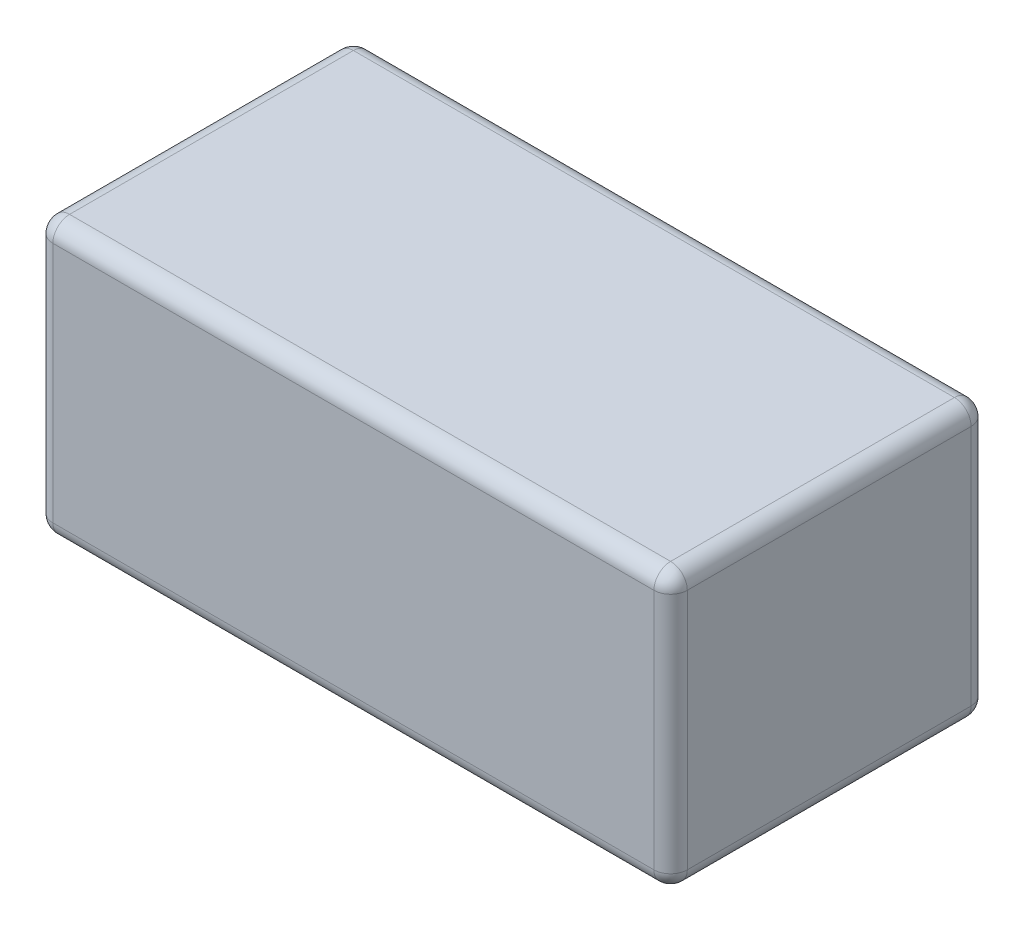
ISO-10303-21;
HEADER;
FILE_DESCRIPTION(('STEP AP214'),'2;1');
FILE_NAME('part.step','',(''),(''),'','','');
FILE_SCHEMA(('AUTOMOTIVE_DESIGN { 1 0 10303 214 1 1 1 1 }'));
ENDSEC;
DATA;
#1=APPLICATION_CONTEXT('core data for automotive mechanical design processes');
#2=APPLICATION_PROTOCOL_DEFINITION('international standard','automotive_design',2000,#1);
#3=PRODUCT_CONTEXT('',#1,'mechanical');
#4=PRODUCT('Part','Part','',(#3));
#5=PRODUCT_RELATED_PRODUCT_CATEGORY('part','',(#4));
#6=PRODUCT_DEFINITION_FORMATION('','',#4);
#7=PRODUCT_DEFINITION_CONTEXT('part definition',#1,'design');
#8=PRODUCT_DEFINITION('design','',#6,#7);
#9=PRODUCT_DEFINITION_SHAPE('','',#8);
#10=(LENGTH_UNIT() NAMED_UNIT(*) SI_UNIT(.MILLI.,.METRE.));
#11=(NAMED_UNIT(*) PLANE_ANGLE_UNIT() SI_UNIT($,.RADIAN.));
#12=(NAMED_UNIT(*) SI_UNIT($,.STERADIAN.) SOLID_ANGLE_UNIT());
#13=UNCERTAINTY_MEASURE_WITH_UNIT(LENGTH_MEASURE(1.E-05),#10,'distance_accuracy_value','');
#14=(GEOMETRIC_REPRESENTATION_CONTEXT(3) GLOBAL_UNCERTAINTY_ASSIGNED_CONTEXT((#13)) GLOBAL_UNIT_ASSIGNED_CONTEXT((#10,
#11,#12)) REPRESENTATION_CONTEXT('',''));
#15=CARTESIAN_POINT('',(0.,0.,0.));
#16=DIRECTION('',(0.,0.,1.));
#17=DIRECTION('',(1.,0.,0.));
#18=AXIS2_PLACEMENT_3D('',#15,#16,#17);
#19=CARTESIAN_POINT('',(38.,33.,19.));
#20=DIRECTION('',(-1.,0.,0.));
#21=DIRECTION('',(0.,0.,1.));
#22=AXIS2_PLACEMENT_3D('',#19,#20,#21);
#23=PLANE('',#22);
#24=DIRECTION('',(0.,0.,-1.));
#25=VECTOR('',#24,1.);
#26=CARTESIAN_POINT('',(38.,31.,19.));
#27=LINE('',#26,#25);
#28=CARTESIAN_POINT('',(38.,31.,-17.));
#29=VERTEX_POINT('',#28);
#30=CARTESIAN_POINT('',(38.,31.,17.));
#31=VERTEX_POINT('',#30);
#32=EDGE_CURVE('E53',#29,#31,#27,.F.);
#33=ORIENTED_EDGE('',*,*,#32,.T.);
#34=DIRECTION('',(0.,-1.,0.));
#35=VECTOR('',#34,1.);
#36=CARTESIAN_POINT('',(38.,33.,17.));
#37=LINE('',#36,#35);
#38=CARTESIAN_POINT('',(38.,2.,17.));
#39=VERTEX_POINT('',#38);
#40=EDGE_CURVE('E11',#31,#39,#37,.T.);
#41=ORIENTED_EDGE('',*,*,#40,.T.);
#42=DIRECTION('',(0.,0.,-1.));
#43=VECTOR('',#42,1.);
#44=CARTESIAN_POINT('',(38.,2.,-19.));
#45=LINE('',#44,#43);
#46=CARTESIAN_POINT('',(38.,2.,-17.));
#47=VERTEX_POINT('',#46);
#48=EDGE_CURVE('E226',#39,#47,#45,.T.);
#49=ORIENTED_EDGE('',*,*,#48,.T.);
#50=DIRECTION('',(0.,-1.,0.));
#51=VECTOR('',#50,1.);
#52=CARTESIAN_POINT('',(38.,33.,-17.));
#53=LINE('',#52,#51);
#54=EDGE_CURVE('E64',#47,#29,#53,.F.);
#55=ORIENTED_EDGE('',*,*,#54,.T.);
#56=EDGE_LOOP('',(#33,#41,#49,#55));
#57=FACE_BOUND('',#56,.T.);
#58=ADVANCED_FACE('F43',(#57),#23,.F.);
#59=CARTESIAN_POINT('',(-38.,33.,-19.));
#60=DIRECTION('',(0.,0.,1.));
#61=DIRECTION('',(1.,0.,0.));
#62=AXIS2_PLACEMENT_3D('',#59,#60,#61);
#63=PLANE('',#62);
#64=DIRECTION('',(0.,-1.,0.));
#65=VECTOR('',#64,1.);
#66=CARTESIAN_POINT('',(-36.,33.,-19.));
#67=LINE('',#66,#65);
#68=CARTESIAN_POINT('',(-36.,2.,-19.));
#69=VERTEX_POINT('',#68);
#70=CARTESIAN_POINT('',(-36.,31.,-19.));
#71=VERTEX_POINT('',#70);
#72=EDGE_CURVE('E219',#69,#71,#67,.F.);
#73=ORIENTED_EDGE('',*,*,#72,.T.);
#74=DIRECTION('',(-1.,0.,0.));
#75=VECTOR('',#74,1.);
#76=CARTESIAN_POINT('',(-38.,31.,-19.));
#77=LINE('',#76,#75);
#78=CARTESIAN_POINT('',(36.,31.,-19.));
#79=VERTEX_POINT('',#78);
#80=EDGE_CURVE('E222',#71,#79,#77,.F.);
#81=ORIENTED_EDGE('',*,*,#80,.T.);
#82=DIRECTION('',(0.,-1.,0.));
#83=VECTOR('',#82,1.);
#84=CARTESIAN_POINT('',(36.,33.,-19.));
#85=LINE('',#84,#83);
#86=CARTESIAN_POINT('',(36.,2.,-19.));
#87=VERTEX_POINT('',#86);
#88=EDGE_CURVE('E213',#79,#87,#85,.T.);
#89=ORIENTED_EDGE('',*,*,#88,.T.);
#90=DIRECTION('',(-1.,0.,0.));
#91=VECTOR('',#90,1.);
#92=CARTESIAN_POINT('',(-38.,2.,-19.));
#93=LINE('',#92,#91);
#94=EDGE_CURVE('E216',#87,#69,#93,.T.);
#95=ORIENTED_EDGE('',*,*,#94,.T.);
#96=EDGE_LOOP('',(#73,#81,#89,#95));
#97=FACE_BOUND('',#96,.T.);
#98=ADVANCED_FACE('F357',(#97),#63,.F.);
#99=CARTESIAN_POINT('',(-38.,33.,19.));
#100=DIRECTION('',(1.,0.,0.));
#101=DIRECTION('',(0.,0.,-1.));
#102=AXIS2_PLACEMENT_3D('',#99,#100,#101);
#103=PLANE('',#102);
#104=DIRECTION('',(0.,-1.,0.));
#105=VECTOR('',#104,1.);
#106=CARTESIAN_POINT('',(-38.,33.,17.));
#107=LINE('',#106,#105);
#108=CARTESIAN_POINT('',(-38.,2.,17.));
#109=VERTEX_POINT('',#108);
#110=CARTESIAN_POINT('',(-38.,31.,17.));
#111=VERTEX_POINT('',#110);
#112=EDGE_CURVE('E193',#109,#111,#107,.F.);
#113=ORIENTED_EDGE('',*,*,#112,.T.);
#114=DIRECTION('',(0.,0.,1.));
#115=VECTOR('',#114,1.);
#116=CARTESIAN_POINT('',(-38.,31.,19.));
#117=LINE('',#116,#115);
#118=CARTESIAN_POINT('',(-38.,31.,-17.));
#119=VERTEX_POINT('',#118);
#120=EDGE_CURVE('E196',#111,#119,#117,.F.);
#121=ORIENTED_EDGE('',*,*,#120,.T.);
#122=DIRECTION('',(0.,-1.,0.));
#123=VECTOR('',#122,1.);
#124=CARTESIAN_POINT('',(-38.,33.,-17.));
#125=LINE('',#124,#123);
#126=CARTESIAN_POINT('',(-38.,2.,-17.));
#127=VERTEX_POINT('',#126);
#128=EDGE_CURVE('E187',#119,#127,#125,.T.);
#129=ORIENTED_EDGE('',*,*,#128,.T.);
#130=DIRECTION('',(0.,0.,1.));
#131=VECTOR('',#130,1.);
#132=CARTESIAN_POINT('',(-38.,2.,19.));
#133=LINE('',#132,#131);
#134=EDGE_CURVE('E190',#127,#109,#133,.T.);
#135=ORIENTED_EDGE('',*,*,#134,.T.);
#136=EDGE_LOOP('',(#113,#121,#129,#135));
#137=FACE_BOUND('',#136,.T.);
#138=ADVANCED_FACE('F343',(#137),#103,.F.);
#139=CARTESIAN_POINT('',(-38.,33.,19.));
#140=DIRECTION('',(0.,0.,-1.));
#141=DIRECTION('',(-1.,0.,0.));
#142=AXIS2_PLACEMENT_3D('',#139,#140,#141);
#143=PLANE('',#142);
#144=DIRECTION('',(0.,-1.,0.));
#145=VECTOR('',#144,1.);
#146=CARTESIAN_POINT('',(36.,33.,19.));
#147=LINE('',#146,#145);
#148=CARTESIAN_POINT('',(36.,2.,19.));
#149=VERTEX_POINT('',#148);
#150=CARTESIAN_POINT('',(36.,31.,19.));
#151=VERTEX_POINT('',#150);
#152=EDGE_CURVE('E171',#149,#151,#147,.F.);
#153=ORIENTED_EDGE('',*,*,#152,.T.);
#154=DIRECTION('',(1.,0.,0.));
#155=VECTOR('',#154,1.);
#156=CARTESIAN_POINT('',(-38.,31.,19.));
#157=LINE('',#156,#155);
#158=CARTESIAN_POINT('',(-36.,31.,19.));
#159=VERTEX_POINT('',#158);
#160=EDGE_CURVE('E140',#151,#159,#157,.F.);
#161=ORIENTED_EDGE('',*,*,#160,.T.);
#162=DIRECTION('',(0.,-1.,0.));
#163=VECTOR('',#162,1.);
#164=CARTESIAN_POINT('',(-36.,33.,19.));
#165=LINE('',#164,#163);
#166=CARTESIAN_POINT('',(-36.,2.,19.));
#167=VERTEX_POINT('',#166);
#168=EDGE_CURVE('E182',#159,#167,#165,.T.);
#169=ORIENTED_EDGE('',*,*,#168,.T.);
#170=DIRECTION('',(1.,0.,0.));
#171=VECTOR('',#170,1.);
#172=CARTESIAN_POINT('',(38.,2.,19.));
#173=LINE('',#172,#171);
#174=EDGE_CURVE('E175',#167,#149,#173,.T.);
#175=ORIENTED_EDGE('',*,*,#174,.T.);
#176=EDGE_LOOP('',(#153,#161,#169,#175));
#177=FACE_BOUND('',#176,.T.);
#178=ADVANCED_FACE('F377',(#177),#143,.F.);
#179=CARTESIAN_POINT('',(0.,33.,0.));
#180=DIRECTION('',(0.,-1.,0.));
#181=DIRECTION('',(0.,0.,-1.));
#182=AXIS2_PLACEMENT_3D('',#179,#180,#181);
#183=PLANE('',#182);
#184=DIRECTION('',(0.,0.,1.));
#185=VECTOR('',#184,1.);
#186=CARTESIAN_POINT('',(-36.,33.,0.));
#187=LINE('',#186,#185);
#188=CARTESIAN_POINT('',(-36.,33.,-17.));
#189=VERTEX_POINT('',#188);
#190=CARTESIAN_POINT('',(-36.,33.,17.));
#191=VERTEX_POINT('',#190);
#192=EDGE_CURVE('E168',#189,#191,#187,.T.);
#193=ORIENTED_EDGE('',*,*,#192,.T.);
#194=DIRECTION('',(1.,0.,0.));
#195=VECTOR('',#194,1.);
#196=CARTESIAN_POINT('',(0.,33.,17.));
#197=LINE('',#196,#195);
#198=CARTESIAN_POINT('',(36.,33.,17.));
#199=VERTEX_POINT('',#198);
#200=EDGE_CURVE('E138',#191,#199,#197,.T.);
#201=ORIENTED_EDGE('',*,*,#200,.T.);
#202=DIRECTION('',(0.,0.,-1.));
#203=VECTOR('',#202,1.);
#204=CARTESIAN_POINT('',(36.,33.,0.));
#205=LINE('',#204,#203);
#206=CARTESIAN_POINT('',(36.,33.,-17.));
#207=VERTEX_POINT('',#206);
#208=EDGE_CURVE('E157',#199,#207,#205,.T.);
#209=ORIENTED_EDGE('',*,*,#208,.T.);
#210=DIRECTION('',(-1.,0.,0.));
#211=VECTOR('',#210,1.);
#212=CARTESIAN_POINT('',(0.,33.,-17.));
#213=LINE('',#212,#211);
#214=EDGE_CURVE('E164',#207,#189,#213,.T.);
#215=ORIENTED_EDGE('',*,*,#214,.T.);
#216=EDGE_LOOP('',(#193,#201,#209,#215));
#217=FACE_BOUND('',#216,.T.);
#218=ADVANCED_FACE('F166',(#217),#183,.F.);
#219=CARTESIAN_POINT('',(0.,0.,0.));
#220=DIRECTION('',(0.,-1.,0.));
#221=DIRECTION('',(0.,0.,-1.));
#222=AXIS2_PLACEMENT_3D('',#219,#220,#221);
#223=PLANE('',#222);
#224=DIRECTION('',(1.,0.,0.));
#225=VECTOR('',#224,1.);
#226=CARTESIAN_POINT('',(-38.,0.,17.));
#227=LINE('',#226,#225);
#228=CARTESIAN_POINT('',(36.,0.,17.));
#229=VERTEX_POINT('',#228);
#230=CARTESIAN_POINT('',(-36.,0.,17.));
#231=VERTEX_POINT('',#230);
#232=EDGE_CURVE('E206',#229,#231,#227,.F.);
#233=ORIENTED_EDGE('',*,*,#232,.T.);
#234=DIRECTION('',(0.,0.,1.));
#235=VECTOR('',#234,1.);
#236=CARTESIAN_POINT('',(-36.,0.,-19.));
#237=LINE('',#236,#235);
#238=CARTESIAN_POINT('',(-36.,0.,-17.));
#239=VERTEX_POINT('',#238);
#240=EDGE_CURVE('E209',#231,#239,#237,.F.);
#241=ORIENTED_EDGE('',*,*,#240,.T.);
#242=DIRECTION('',(-1.,0.,0.));
#243=VECTOR('',#242,1.);
#244=CARTESIAN_POINT('',(38.,0.,-17.));
#245=LINE('',#244,#243);
#246=CARTESIAN_POINT('',(36.,0.,-17.));
#247=VERTEX_POINT('',#246);
#248=EDGE_CURVE('E203',#239,#247,#245,.F.);
#249=ORIENTED_EDGE('',*,*,#248,.T.);
#250=DIRECTION('',(0.,0.,-1.));
#251=VECTOR('',#250,1.);
#252=CARTESIAN_POINT('',(36.,0.,19.));
#253=LINE('',#252,#251);
#254=EDGE_CURVE('E200',#247,#229,#253,.F.);
#255=ORIENTED_EDGE('',*,*,#254,.T.);
#256=EDGE_LOOP('',(#233,#241,#249,#255));
#257=FACE_BOUND('',#256,.T.);
#258=ADVANCED_FACE('F322',(#257),#223,.T.);
#259=CARTESIAN_POINT('',(-38.,2.,-17.));
#260=DIRECTION('',(1.,0.,0.));
#261=DIRECTION('',(0.,0.,-1.));
#262=AXIS2_PLACEMENT_3D('',#259,#260,#261);
#263=CYLINDRICAL_SURFACE('',#262,2.);
#264=CARTESIAN_POINT('',(-36.,2.,-17.));
#265=DIRECTION('',(-1.,0.,0.));
#266=DIRECTION('',(0.,0.,1.));
#267=AXIS2_PLACEMENT_3D('',#264,#265,#266);
#268=CIRCLE('',#267,2.);
#269=EDGE_CURVE('E47',#69,#239,#268,.T.);
#270=ORIENTED_EDGE('',*,*,#269,.F.);
#271=ORIENTED_EDGE('',*,*,#94,.F.);
#272=CARTESIAN_POINT('',(36.,2.,-17.));
#273=DIRECTION('',(1.,0.,0.));
#274=DIRECTION('',(0.,0.,-1.));
#275=AXIS2_PLACEMENT_3D('',#272,#273,#274);
#276=CIRCLE('',#275,2.);
#277=EDGE_CURVE('E301',#247,#87,#276,.T.);
#278=ORIENTED_EDGE('',*,*,#277,.F.);
#279=ORIENTED_EDGE('',*,*,#248,.F.);
#280=EDGE_LOOP('',(#270,#271,#278,#279));
#281=FACE_BOUND('',#280,.T.);
#282=ADVANCED_FACE('F45',(#281),#263,.T.);
#283=CARTESIAN_POINT('',(-36.,2.,-17.));
#284=DIRECTION('',(0.,-1.,0.));
#285=DIRECTION('',(0.,0.,-1.));
#286=AXIS2_PLACEMENT_3D('',#283,#284,#285);
#287=SPHERICAL_SURFACE('',#286,2.);
#288=CARTESIAN_POINT('',(-36.,2.,-17.));
#289=DIRECTION('',(0.,-1.,0.));
#290=DIRECTION('',(0.,0.,-1.));
#291=AXIS2_PLACEMENT_3D('',#288,#289,#290);
#292=CIRCLE('',#291,2.);
#293=EDGE_CURVE('E295',#69,#127,#292,.F.);
#294=ORIENTED_EDGE('',*,*,#293,.F.);
#295=ORIENTED_EDGE('',*,*,#269,.T.);
#296=CARTESIAN_POINT('',(-36.,2.,-17.));
#297=DIRECTION('',(0.,0.,-1.));
#298=DIRECTION('',(-1.,0.,0.));
#299=AXIS2_PLACEMENT_3D('',#296,#297,#298);
#300=CIRCLE('',#299,2.);
#301=EDGE_CURVE('E299',#127,#239,#300,.F.);
#302=ORIENTED_EDGE('',*,*,#301,.F.);
#303=EDGE_LOOP('',(#294,#295,#302));
#304=FACE_BOUND('',#303,.T.);
#305=ADVANCED_FACE('F315',(#304),#287,.T.);
#306=CARTESIAN_POINT('',(36.,2.,-17.));
#307=DIRECTION('',(0.,0.,-1.));
#308=DIRECTION('',(0.,1.,0.));
#309=AXIS2_PLACEMENT_3D('',#306,#307,#308);
#310=SPHERICAL_SURFACE('',#309,2.);
#311=CARTESIAN_POINT('',(36.,2.,-17.));
#312=DIRECTION('',(0.,0.,-1.));
#313=DIRECTION('',(-1.,0.,0.));
#314=AXIS2_PLACEMENT_3D('',#311,#312,#313);
#315=CIRCLE('',#314,2.);
#316=EDGE_CURVE('E287',#247,#47,#315,.F.);
#317=ORIENTED_EDGE('',*,*,#316,.F.);
#318=ORIENTED_EDGE('',*,*,#277,.T.);
#319=CARTESIAN_POINT('',(36.,2.,-17.));
#320=DIRECTION('',(0.,-1.,0.));
#321=DIRECTION('',(0.,0.,-1.));
#322=AXIS2_PLACEMENT_3D('',#319,#320,#321);
#323=CIRCLE('',#322,2.);
#324=EDGE_CURVE('E291',#47,#87,#323,.F.);
#325=ORIENTED_EDGE('',*,*,#324,.F.);
#326=EDGE_LOOP('',(#317,#318,#325));
#327=FACE_BOUND('',#326,.T.);
#328=ADVANCED_FACE('F365',(#327),#310,.T.);
#329=CARTESIAN_POINT('',(-36.,2.,19.));
#330=DIRECTION('',(0.,0.,-1.));
#331=DIRECTION('',(-1.,0.,0.));
#332=AXIS2_PLACEMENT_3D('',#329,#330,#331);
#333=CYLINDRICAL_SURFACE('',#332,2.);
#334=ORIENTED_EDGE('',*,*,#301,.T.);
#335=ORIENTED_EDGE('',*,*,#240,.F.);
#336=CARTESIAN_POINT('',(-36.,2.,17.));
#337=DIRECTION('',(0.,0.,1.));
#338=DIRECTION('',(1.,0.,0.));
#339=AXIS2_PLACEMENT_3D('',#336,#337,#338);
#340=CIRCLE('',#339,2.);
#341=EDGE_CURVE('E279',#109,#231,#340,.T.);
#342=ORIENTED_EDGE('',*,*,#341,.F.);
#343=ORIENTED_EDGE('',*,*,#134,.F.);
#344=EDGE_LOOP('',(#334,#335,#342,#343));
#345=FACE_BOUND('',#344,.T.);
#346=ADVANCED_FACE('F327',(#345),#333,.T.);
#347=CARTESIAN_POINT('',(-36.,33.,-17.));
#348=DIRECTION('',(0.,-1.,0.));
#349=DIRECTION('',(0.,0.,-1.));
#350=AXIS2_PLACEMENT_3D('',#347,#348,#349);
#351=CYLINDRICAL_SURFACE('',#350,2.);
#352=ORIENTED_EDGE('',*,*,#293,.T.);
#353=ORIENTED_EDGE('',*,*,#128,.F.);
#354=CARTESIAN_POINT('',(-36.,31.,-17.));
#355=DIRECTION('',(0.,1.,0.));
#356=DIRECTION('',(0.,0.,1.));
#357=AXIS2_PLACEMENT_3D('',#354,#355,#356);
#358=CIRCLE('',#357,2.);
#359=EDGE_CURVE('E275',#71,#119,#358,.T.);
#360=ORIENTED_EDGE('',*,*,#359,.F.);
#361=ORIENTED_EDGE('',*,*,#72,.F.);
#362=EDGE_LOOP('',(#352,#353,#360,#361));
#363=FACE_BOUND('',#362,.T.);
#364=ADVANCED_FACE('F354',(#363),#351,.T.);
#365=CARTESIAN_POINT('',(0.,31.,-17.));
#366=DIRECTION('',(-1.,0.,0.));
#367=DIRECTION('',(0.,0.,1.));
#368=AXIS2_PLACEMENT_3D('',#365,#366,#367);
#369=CYLINDRICAL_SURFACE('',#368,2.);
#370=CARTESIAN_POINT('',(36.,31.,-17.));
#371=DIRECTION('',(1.,0.,0.));
#372=DIRECTION('',(0.,0.,-1.));
#373=AXIS2_PLACEMENT_3D('',#370,#371,#372);
#374=CIRCLE('',#373,2.);
#375=EDGE_CURVE('E267',#79,#207,#374,.T.);
#376=ORIENTED_EDGE('',*,*,#375,.F.);
#377=ORIENTED_EDGE('',*,*,#80,.F.);
#378=CARTESIAN_POINT('',(-36.,31.,-17.));
#379=DIRECTION('',(-1.,0.,0.));
#380=DIRECTION('',(0.,0.,1.));
#381=AXIS2_PLACEMENT_3D('',#378,#379,#380);
#382=CIRCLE('',#381,2.);
#383=EDGE_CURVE('E271',#189,#71,#382,.T.);
#384=ORIENTED_EDGE('',*,*,#383,.F.);
#385=ORIENTED_EDGE('',*,*,#214,.F.);
#386=EDGE_LOOP('',(#376,#377,#384,#385));
#387=FACE_BOUND('',#386,.T.);
#388=ADVANCED_FACE('F360',(#387),#369,.T.);
#389=CARTESIAN_POINT('',(36.,33.,-17.));
#390=DIRECTION('',(0.,-1.,0.));
#391=DIRECTION('',(0.,0.,-1.));
#392=AXIS2_PLACEMENT_3D('',#389,#390,#391);
#393=CYLINDRICAL_SURFACE('',#392,2.);
#394=ORIENTED_EDGE('',*,*,#324,.T.);
#395=ORIENTED_EDGE('',*,*,#88,.F.);
#396=CARTESIAN_POINT('',(36.,31.,-17.));
#397=DIRECTION('',(0.,1.,0.));
#398=DIRECTION('',(0.,0.,1.));
#399=AXIS2_PLACEMENT_3D('',#396,#397,#398);
#400=CIRCLE('',#399,2.);
#401=EDGE_CURVE('E264',#29,#79,#400,.T.);
#402=ORIENTED_EDGE('',*,*,#401,.F.);
#403=ORIENTED_EDGE('',*,*,#54,.F.);
#404=EDGE_LOOP('',(#394,#395,#402,#403));
#405=FACE_BOUND('',#404,.T.);
#406=ADVANCED_FACE('F364',(#405),#393,.T.);
#407=CARTESIAN_POINT('',(36.,2.,19.));
#408=DIRECTION('',(0.,0.,1.));
#409=DIRECTION('',(1.,0.,0.));
#410=AXIS2_PLACEMENT_3D('',#407,#408,#409);
#411=CYLINDRICAL_SURFACE('',#410,2.);
#412=ORIENTED_EDGE('',*,*,#316,.T.);
#413=ORIENTED_EDGE('',*,*,#48,.F.);
#414=CARTESIAN_POINT('',(36.,2.,17.));
#415=DIRECTION('',(0.,0.,1.));
#416=DIRECTION('',(1.,0.,0.));
#417=AXIS2_PLACEMENT_3D('',#414,#415,#416);
#418=CIRCLE('',#417,2.);
#419=EDGE_CURVE('E260',#229,#39,#418,.T.);
#420=ORIENTED_EDGE('',*,*,#419,.F.);
#421=ORIENTED_EDGE('',*,*,#254,.F.);
#422=EDGE_LOOP('',(#412,#413,#420,#421));
#423=FACE_BOUND('',#422,.T.);
#424=ADVANCED_FACE('F369',(#423),#411,.T.);
#425=CARTESIAN_POINT('',(-38.,2.,17.));
#426=DIRECTION('',(-1.,0.,0.));
#427=DIRECTION('',(0.,0.,1.));
#428=AXIS2_PLACEMENT_3D('',#425,#426,#427);
#429=CYLINDRICAL_SURFACE('',#428,2.);
#430=CARTESIAN_POINT('',(-36.,2.,17.));
#431=DIRECTION('',(-1.,0.,0.));
#432=DIRECTION('',(0.,0.,1.));
#433=AXIS2_PLACEMENT_3D('',#430,#431,#432);
#434=CIRCLE('',#433,2.);
#435=EDGE_CURVE('E283',#231,#167,#434,.T.);
#436=ORIENTED_EDGE('',*,*,#435,.F.);
#437=ORIENTED_EDGE('',*,*,#232,.F.);
#438=CARTESIAN_POINT('',(36.,2.,17.));
#439=DIRECTION('',(1.,0.,0.));
#440=DIRECTION('',(0.,0.,-1.));
#441=AXIS2_PLACEMENT_3D('',#438,#439,#440);
#442=CIRCLE('',#441,2.);
#443=EDGE_CURVE('E256',#149,#229,#442,.T.);
#444=ORIENTED_EDGE('',*,*,#443,.F.);
#445=ORIENTED_EDGE('',*,*,#174,.F.);
#446=EDGE_LOOP('',(#436,#437,#444,#445));
#447=FACE_BOUND('',#446,.T.);
#448=ADVANCED_FACE('F331',(#447),#429,.T.);
#449=CARTESIAN_POINT('',(-36.,2.,17.));
#450=DIRECTION('',(0.,-1.,0.));
#451=DIRECTION('',(0.,0.,-1.));
#452=AXIS2_PLACEMENT_3D('',#449,#450,#451);
#453=SPHERICAL_SURFACE('',#452,2.);
#454=ORIENTED_EDGE('',*,*,#341,.T.);
#455=ORIENTED_EDGE('',*,*,#435,.T.);
#456=CARTESIAN_POINT('',(-36.,2.,17.));
#457=DIRECTION('',(0.,-1.,0.));
#458=DIRECTION('',(0.,0.,-1.));
#459=AXIS2_PLACEMENT_3D('',#456,#457,#458);
#460=CIRCLE('',#459,2.);
#461=EDGE_CURVE('E252',#109,#167,#460,.F.);
#462=ORIENTED_EDGE('',*,*,#461,.F.);
#463=EDGE_LOOP('',(#454,#455,#462));
#464=FACE_BOUND('',#463,.T.);
#465=ADVANCED_FACE('F335',(#464),#453,.T.);
#466=CARTESIAN_POINT('',(-36.,31.,-17.));
#467=DIRECTION('',(0.,0.,-1.));
#468=DIRECTION('',(-1.,0.,0.));
#469=AXIS2_PLACEMENT_3D('',#466,#467,#468);
#470=SPHERICAL_SURFACE('',#469,2.);
#471=ORIENTED_EDGE('',*,*,#383,.T.);
#472=ORIENTED_EDGE('',*,*,#359,.T.);
#473=CARTESIAN_POINT('',(-36.,31.,-17.));
#474=DIRECTION('',(0.,0.,-1.));
#475=DIRECTION('',(-1.,0.,0.));
#476=AXIS2_PLACEMENT_3D('',#473,#474,#475);
#477=CIRCLE('',#476,2.);
#478=EDGE_CURVE('E249',#189,#119,#477,.F.);
#479=ORIENTED_EDGE('',*,*,#478,.F.);
#480=EDGE_LOOP('',(#471,#472,#479));
#481=FACE_BOUND('',#480,.T.);
#482=ADVANCED_FACE('F351',(#481),#470,.T.);
#483=CARTESIAN_POINT('',(36.,31.,-17.));
#484=DIRECTION('',(0.,0.,-1.));
#485=DIRECTION('',(-1.,0.,0.));
#486=AXIS2_PLACEMENT_3D('',#483,#484,#485);
#487=SPHERICAL_SURFACE('',#486,2.);
#488=ORIENTED_EDGE('',*,*,#401,.T.);
#489=ORIENTED_EDGE('',*,*,#375,.T.);
#490=CARTESIAN_POINT('',(36.,31.,-17.));
#491=DIRECTION('',(0.,0.,-1.));
#492=DIRECTION('',(-1.,0.,0.));
#493=AXIS2_PLACEMENT_3D('',#490,#491,#492);
#494=CIRCLE('',#493,2.);
#495=EDGE_CURVE('E160',#29,#207,#494,.F.);
#496=ORIENTED_EDGE('',*,*,#495,.F.);
#497=EDGE_LOOP('',(#488,#489,#496));
#498=FACE_BOUND('',#497,.T.);
#499=ADVANCED_FACE('F412',(#498),#487,.T.);
#500=CARTESIAN_POINT('',(36.,2.,17.));
#501=DIRECTION('',(0.,-1.,0.));
#502=DIRECTION('',(0.,0.,-1.));
#503=AXIS2_PLACEMENT_3D('',#500,#501,#502);
#504=SPHERICAL_SURFACE('',#503,2.);
#505=ORIENTED_EDGE('',*,*,#443,.T.);
#506=ORIENTED_EDGE('',*,*,#419,.T.);
#507=CARTESIAN_POINT('',(36.,2.,17.));
#508=DIRECTION('',(0.,-1.,0.));
#509=DIRECTION('',(0.,0.,-1.));
#510=AXIS2_PLACEMENT_3D('',#507,#508,#509);
#511=CIRCLE('',#510,2.);
#512=EDGE_CURVE('E244',#149,#39,#511,.F.);
#513=ORIENTED_EDGE('',*,*,#512,.F.);
#514=EDGE_LOOP('',(#505,#506,#513));
#515=FACE_BOUND('',#514,.T.);
#516=ADVANCED_FACE('F372',(#515),#504,.T.);
#517=CARTESIAN_POINT('',(-36.,33.,17.));
#518=DIRECTION('',(0.,-1.,0.));
#519=DIRECTION('',(0.,0.,-1.));
#520=AXIS2_PLACEMENT_3D('',#517,#518,#519);
#521=CYLINDRICAL_SURFACE('',#520,2.);
#522=ORIENTED_EDGE('',*,*,#461,.T.);
#523=ORIENTED_EDGE('',*,*,#168,.F.);
#524=CARTESIAN_POINT('',(-36.,31.,17.));
#525=DIRECTION('',(0.,1.,0.));
#526=DIRECTION('',(0.,0.,1.));
#527=AXIS2_PLACEMENT_3D('',#524,#525,#526);
#528=CIRCLE('',#527,2.);
#529=EDGE_CURVE('E240',#111,#159,#528,.T.);
#530=ORIENTED_EDGE('',*,*,#529,.F.);
#531=ORIENTED_EDGE('',*,*,#112,.F.);
#532=EDGE_LOOP('',(#522,#523,#530,#531));
#533=FACE_BOUND('',#532,.T.);
#534=ADVANCED_FACE('F340',(#533),#521,.T.);
#535=CARTESIAN_POINT('',(-36.,31.,0.));
#536=DIRECTION('',(0.,0.,1.));
#537=DIRECTION('',(1.,0.,0.));
#538=AXIS2_PLACEMENT_3D('',#535,#536,#537);
#539=CYLINDRICAL_SURFACE('',#538,2.);
#540=ORIENTED_EDGE('',*,*,#478,.T.);
#541=ORIENTED_EDGE('',*,*,#120,.F.);
#542=CARTESIAN_POINT('',(-36.,31.,17.));
#543=DIRECTION('',(0.,0.,1.));
#544=DIRECTION('',(1.,0.,0.));
#545=AXIS2_PLACEMENT_3D('',#542,#543,#544);
#546=CIRCLE('',#545,2.);
#547=EDGE_CURVE('E154',#191,#111,#546,.T.);
#548=ORIENTED_EDGE('',*,*,#547,.F.);
#549=ORIENTED_EDGE('',*,*,#192,.F.);
#550=EDGE_LOOP('',(#540,#541,#548,#549));
#551=FACE_BOUND('',#550,.T.);
#552=ADVANCED_FACE('F345',(#551),#539,.T.);
#553=CARTESIAN_POINT('',(36.,31.,0.));
#554=DIRECTION('',(0.,0.,-1.));
#555=DIRECTION('',(-1.,0.,0.));
#556=AXIS2_PLACEMENT_3D('',#553,#554,#555);
#557=CYLINDRICAL_SURFACE('',#556,2.);
#558=ORIENTED_EDGE('',*,*,#495,.T.);
#559=ORIENTED_EDGE('',*,*,#208,.F.);
#560=CARTESIAN_POINT('',(36.,31.,17.));
#561=DIRECTION('',(0.,0.,1.));
#562=DIRECTION('',(1.,0.,0.));
#563=AXIS2_PLACEMENT_3D('',#560,#561,#562);
#564=CIRCLE('',#563,2.);
#565=EDGE_CURVE('E147',#31,#199,#564,.T.);
#566=ORIENTED_EDGE('',*,*,#565,.F.);
#567=ORIENTED_EDGE('',*,*,#32,.F.);
#568=EDGE_LOOP('',(#558,#559,#566,#567));
#569=FACE_BOUND('',#568,.T.);
#570=ADVANCED_FACE('F158',(#569),#557,.T.);
#571=CARTESIAN_POINT('',(36.,33.,17.));
#572=DIRECTION('',(0.,-1.,0.));
#573=DIRECTION('',(0.,0.,-1.));
#574=AXIS2_PLACEMENT_3D('',#571,#572,#573);
#575=CYLINDRICAL_SURFACE('',#574,2.);
#576=ORIENTED_EDGE('',*,*,#512,.T.);
#577=ORIENTED_EDGE('',*,*,#40,.F.);
#578=CARTESIAN_POINT('',(36.,31.,17.));
#579=DIRECTION('',(0.,1.,0.));
#580=DIRECTION('',(0.,0.,1.));
#581=AXIS2_PLACEMENT_3D('',#578,#579,#580);
#582=CIRCLE('',#581,2.);
#583=EDGE_CURVE('E151',#151,#31,#582,.T.);
#584=ORIENTED_EDGE('',*,*,#583,.F.);
#585=ORIENTED_EDGE('',*,*,#152,.F.);
#586=EDGE_LOOP('',(#576,#577,#584,#585));
#587=FACE_BOUND('',#586,.T.);
#588=ADVANCED_FACE('F375',(#587),#575,.T.);
#589=CARTESIAN_POINT('',(-36.,31.,17.));
#590=DIRECTION('',(-1.,0.,0.));
#591=DIRECTION('',(0.,0.,1.));
#592=AXIS2_PLACEMENT_3D('',#589,#590,#591);
#593=SPHERICAL_SURFACE('',#592,2.);
#594=ORIENTED_EDGE('',*,*,#547,.T.);
#595=ORIENTED_EDGE('',*,*,#529,.T.);
#596=CARTESIAN_POINT('',(-36.,31.,17.));
#597=DIRECTION('',(-1.,0.,0.));
#598=DIRECTION('',(0.,0.,1.));
#599=AXIS2_PLACEMENT_3D('',#596,#597,#598);
#600=CIRCLE('',#599,2.);
#601=EDGE_CURVE('E144',#191,#159,#600,.F.);
#602=ORIENTED_EDGE('',*,*,#601,.F.);
#603=EDGE_LOOP('',(#594,#595,#602));
#604=FACE_BOUND('',#603,.T.);
#605=ADVANCED_FACE('F398',(#604),#593,.T.);
#606=CARTESIAN_POINT('',(36.,31.,17.));
#607=DIRECTION('',(1.,0.,0.));
#608=DIRECTION('',(0.,0.,-1.));
#609=AXIS2_PLACEMENT_3D('',#606,#607,#608);
#610=SPHERICAL_SURFACE('',#609,2.);
#611=ORIENTED_EDGE('',*,*,#583,.T.);
#612=ORIENTED_EDGE('',*,*,#565,.T.);
#613=CARTESIAN_POINT('',(36.,31.,17.));
#614=DIRECTION('',(1.,0.,0.));
#615=DIRECTION('',(0.,0.,-1.));
#616=AXIS2_PLACEMENT_3D('',#613,#614,#615);
#617=CIRCLE('',#616,2.);
#618=EDGE_CURVE('E134',#151,#199,#617,.F.);
#619=ORIENTED_EDGE('',*,*,#618,.F.);
#620=EDGE_LOOP('',(#611,#612,#619));
#621=FACE_BOUND('',#620,.T.);
#622=ADVANCED_FACE('F149',(#621),#610,.T.);
#623=CARTESIAN_POINT('',(0.,31.,17.));
#624=DIRECTION('',(1.,0.,0.));
#625=DIRECTION('',(0.,0.,-1.));
#626=AXIS2_PLACEMENT_3D('',#623,#624,#625);
#627=CYLINDRICAL_SURFACE('',#626,2.);
#628=ORIENTED_EDGE('',*,*,#601,.T.);
#629=ORIENTED_EDGE('',*,*,#160,.F.);
#630=ORIENTED_EDGE('',*,*,#618,.T.);
#631=ORIENTED_EDGE('',*,*,#200,.F.);
#632=EDGE_LOOP('',(#628,#629,#630,#631));
#633=FACE_BOUND('',#632,.T.);
#634=ADVANCED_FACE('F136',(#633),#627,.T.);
#635=CLOSED_SHELL('',(#58,#98,#138,#178,#218,#258,#282,#305,#328,#346,#364,#388,#406,#424,#448,
#465,#482,#499,#516,#534,#552,#570,#588,#605,#622,#634));
#636=MANIFOLD_SOLID_BREP('B2',#635);
#637=ADVANCED_BREP_SHAPE_REPRESENTATION('',(#18,#636),#14);
#638=SHAPE_DEFINITION_REPRESENTATION(#9,#637);
ENDSEC;
END-ISO-10303-21;
